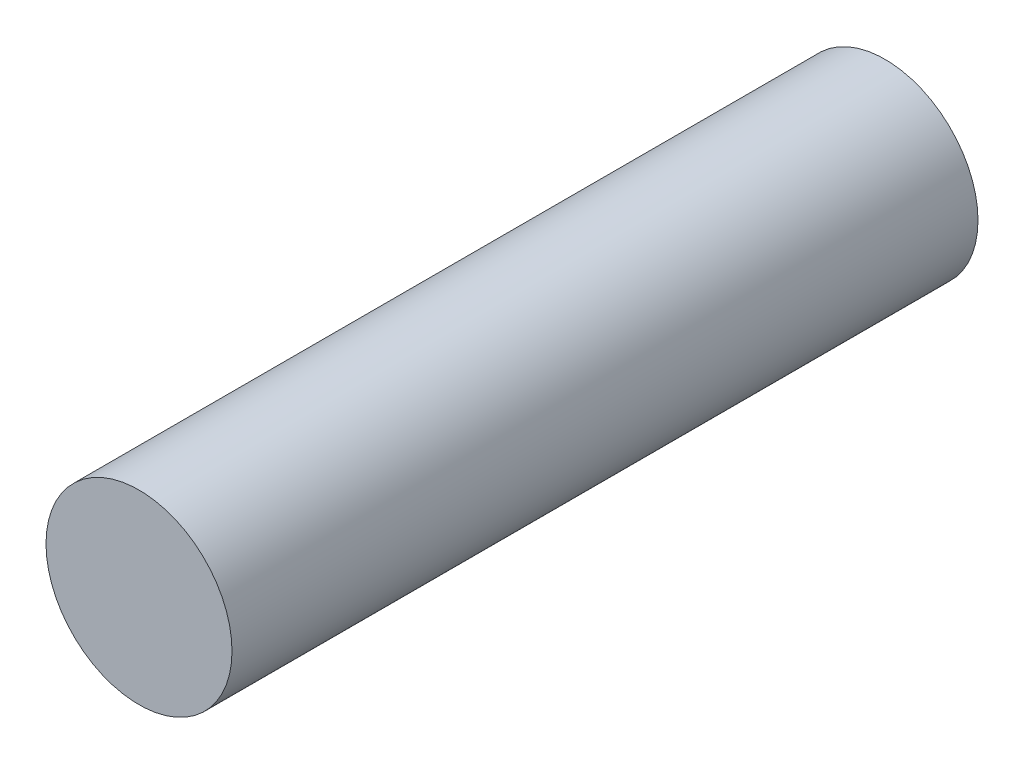
ISO-10303-21;
HEADER;
FILE_DESCRIPTION(('STEP AP214'),'2;1');
FILE_NAME('part.step','',(''),(''),'','','');
FILE_SCHEMA(('AUTOMOTIVE_DESIGN { 1 0 10303 214 1 1 1 1 }'));
ENDSEC;
DATA;
#1=APPLICATION_CONTEXT('core data for automotive mechanical design processes');
#2=APPLICATION_PROTOCOL_DEFINITION('international standard','automotive_design',2000,#1);
#3=PRODUCT_CONTEXT('',#1,'mechanical');
#4=PRODUCT('Part','Part','',(#3));
#5=PRODUCT_RELATED_PRODUCT_CATEGORY('part','',(#4));
#6=PRODUCT_DEFINITION_FORMATION('','',#4);
#7=PRODUCT_DEFINITION_CONTEXT('part definition',#1,'design');
#8=PRODUCT_DEFINITION('design','',#6,#7);
#9=PRODUCT_DEFINITION_SHAPE('','',#8);
#10=(LENGTH_UNIT() NAMED_UNIT(*) SI_UNIT(.MILLI.,.METRE.));
#11=(NAMED_UNIT(*) PLANE_ANGLE_UNIT() SI_UNIT($,.RADIAN.));
#12=(NAMED_UNIT(*) SI_UNIT($,.STERADIAN.) SOLID_ANGLE_UNIT());
#13=UNCERTAINTY_MEASURE_WITH_UNIT(LENGTH_MEASURE(1.E-05),#10,'distance_accuracy_value','');
#14=(GEOMETRIC_REPRESENTATION_CONTEXT(3) GLOBAL_UNCERTAINTY_ASSIGNED_CONTEXT((#13)) GLOBAL_UNIT_ASSIGNED_CONTEXT((#10,
#11,#12)) REPRESENTATION_CONTEXT('',''));
#15=CARTESIAN_POINT('',(0.,0.,0.));
#16=DIRECTION('',(0.,0.,1.));
#17=DIRECTION('',(1.,0.,0.));
#18=AXIS2_PLACEMENT_3D('',#15,#16,#17);
#19=CARTESIAN_POINT('',(-162.918245427395,-13.5765204522829,19.05));
#20=DIRECTION('',(0.,0.,-1.));
#21=DIRECTION('',(-1.,0.,0.));
#22=AXIS2_PLACEMENT_3D('',#19,#20,#21);
#23=CYLINDRICAL_SURFACE('',#22,2.37490000000002);
#24=CARTESIAN_POINT('',(-162.918245427395,-13.5765204522829,19.05));
#25=DIRECTION('',(0.,0.,1.));
#26=DIRECTION('',(1.,0.,0.));
#27=AXIS2_PLACEMENT_3D('',#24,#25,#26);
#28=CIRCLE('',#27,2.37490000000002);
#29=CARTESIAN_POINT('',(-165.293145427395,-13.5765204522829,19.05));
#30=VERTEX_POINT('',#29);
#31=EDGE_CURVE('E10',#30,#30,#28,.T.);
#32=CARTESIAN_POINT('',(-162.918245427395,-13.5765204522829,0.));
#33=DIRECTION('',(0.,0.,1.));
#34=DIRECTION('',(1.,0.,0.));
#35=AXIS2_PLACEMENT_3D('',#32,#33,#34);
#36=CIRCLE('',#35,2.37490000000002);
#37=CARTESIAN_POINT('',(-165.293145427395,-13.5765204522829,0.));
#38=VERTEX_POINT('',#37);
#39=EDGE_CURVE('E35',#38,#38,#36,.T.);
#40=CARTESIAN_POINT('',(-165.293145427395,-13.5765204522829,19.05));
#41=CARTESIAN_POINT('',(-165.293145427395,-13.5765204522829,18.8515625));
#42=CARTESIAN_POINT('',(-165.293145427395,-13.5765204522829,18.653125));
#43=CARTESIAN_POINT('',(-165.293145427395,-13.5765204522829,18.25625));
#44=CARTESIAN_POINT('',(-165.293145427395,-13.5765204522829,18.0578125));
#45=CARTESIAN_POINT('',(-165.293145427395,-13.5765204522829,17.6609375));
#46=CARTESIAN_POINT('',(-165.293145427395,-13.5765204522829,17.4625));
#47=CARTESIAN_POINT('',(-165.293145427395,-13.5765204522829,17.065625));
#48=CARTESIAN_POINT('',(-165.293145427395,-13.5765204522829,16.8671875));
#49=CARTESIAN_POINT('',(-165.293145427395,-13.5765204522829,16.4703125));
#50=CARTESIAN_POINT('',(-165.293145427395,-13.5765204522829,16.271875));
#51=CARTESIAN_POINT('',(-165.293145427395,-13.5765204522829,15.875));
#52=CARTESIAN_POINT('',(-165.293145427395,-13.5765204522829,15.6765625));
#53=CARTESIAN_POINT('',(-165.293145427395,-13.5765204522829,15.2796875));
#54=CARTESIAN_POINT('',(-165.293145427395,-13.5765204522829,15.08125));
#55=CARTESIAN_POINT('',(-165.293145427395,-13.5765204522829,14.684375));
#56=CARTESIAN_POINT('',(-165.293145427395,-13.5765204522829,14.4859375));
#57=CARTESIAN_POINT('',(-165.293145427395,-13.5765204522829,14.0890625));
#58=CARTESIAN_POINT('',(-165.293145427395,-13.5765204522829,13.890625));
#59=CARTESIAN_POINT('',(-165.293145427395,-13.5765204522829,13.49375));
#60=CARTESIAN_POINT('',(-165.293145427395,-13.5765204522829,13.2953125));
#61=CARTESIAN_POINT('',(-165.293145427395,-13.5765204522829,12.8984375));
#62=CARTESIAN_POINT('',(-165.293145427395,-13.5765204522829,12.7));
#63=CARTESIAN_POINT('',(-165.293145427395,-13.5765204522829,12.303125));
#64=CARTESIAN_POINT('',(-165.293145427395,-13.5765204522829,12.1046875));
#65=CARTESIAN_POINT('',(-165.293145427395,-13.5765204522829,11.7078125));
#66=CARTESIAN_POINT('',(-165.293145427395,-13.5765204522829,11.509375));
#67=CARTESIAN_POINT('',(-165.293145427395,-13.5765204522829,11.1125));
#68=CARTESIAN_POINT('',(-165.293145427395,-13.5765204522829,10.9140625));
#69=CARTESIAN_POINT('',(-165.293145427395,-13.5765204522829,10.5171875));
#70=CARTESIAN_POINT('',(-165.293145427395,-13.5765204522829,10.31875));
#71=CARTESIAN_POINT('',(-165.293145427395,-13.5765204522829,9.921875));
#72=CARTESIAN_POINT('',(-165.293145427395,-13.5765204522829,9.7234375));
#73=CARTESIAN_POINT('',(-165.293145427395,-13.5765204522829,9.3265625));
#74=CARTESIAN_POINT('',(-165.293145427395,-13.5765204522829,9.128125));
#75=CARTESIAN_POINT('',(-165.293145427395,-13.5765204522829,8.73125));
#76=CARTESIAN_POINT('',(-165.293145427395,-13.5765204522829,8.5328125));
#77=CARTESIAN_POINT('',(-165.293145427395,-13.5765204522829,8.1359375));
#78=CARTESIAN_POINT('',(-165.293145427395,-13.5765204522829,7.9375));
#79=CARTESIAN_POINT('',(-165.293145427395,-13.5765204522829,7.540625));
#80=CARTESIAN_POINT('',(-165.293145427395,-13.5765204522829,7.3421875));
#81=CARTESIAN_POINT('',(-165.293145427395,-13.5765204522829,6.9453125));
#82=CARTESIAN_POINT('',(-165.293145427395,-13.5765204522829,6.746875));
#83=CARTESIAN_POINT('',(-165.293145427395,-13.5765204522829,6.35));
#84=CARTESIAN_POINT('',(-165.293145427395,-13.5765204522829,6.1515625));
#85=CARTESIAN_POINT('',(-165.293145427395,-13.5765204522829,5.7546875));
#86=CARTESIAN_POINT('',(-165.293145427395,-13.5765204522829,5.55625));
#87=CARTESIAN_POINT('',(-165.293145427395,-13.5765204522829,5.159375));
#88=CARTESIAN_POINT('',(-165.293145427395,-13.5765204522829,4.9609375));
#89=CARTESIAN_POINT('',(-165.293145427395,-13.5765204522829,4.5640625));
#90=CARTESIAN_POINT('',(-165.293145427395,-13.5765204522829,4.365625));
#91=CARTESIAN_POINT('',(-165.293145427395,-13.5765204522829,3.96875));
#92=CARTESIAN_POINT('',(-165.293145427395,-13.5765204522829,3.7703125));
#93=CARTESIAN_POINT('',(-165.293145427395,-13.5765204522829,3.3734375));
#94=CARTESIAN_POINT('',(-165.293145427395,-13.5765204522829,3.175));
#95=CARTESIAN_POINT('',(-165.293145427395,-13.5765204522829,2.778125));
#96=CARTESIAN_POINT('',(-165.293145427395,-13.5765204522829,2.5796875));
#97=CARTESIAN_POINT('',(-165.293145427395,-13.5765204522829,2.1828125));
#98=CARTESIAN_POINT('',(-165.293145427395,-13.5765204522829,1.984375));
#99=CARTESIAN_POINT('',(-165.293145427395,-13.5765204522829,1.5875));
#100=CARTESIAN_POINT('',(-165.293145427395,-13.5765204522829,1.3890625));
#101=CARTESIAN_POINT('',(-165.293145427395,-13.5765204522829,0.992187500000001));
#102=CARTESIAN_POINT('',(-165.293145427395,-13.5765204522829,0.793750000000001));
#103=CARTESIAN_POINT('',(-165.293145427395,-13.5765204522829,0.396875));
#104=CARTESIAN_POINT('',(-165.293145427395,-13.5765204522829,0.1984375));
#105=CARTESIAN_POINT('',(-165.293145427395,-13.5765204522829,0.));
#106=B_SPLINE_CURVE_WITH_KNOTS('',3,(#40,#41,#42,#43,#44,#45,#46,#47,#48,#49,#50,#51,#52,#53,
#54,#55,#56,#57,#58,#59,#60,#61,#62,#63,#64,#65,#66,#67,#68,#69,#70,#71,#72,#73,#74,#75,#76,#77,
#78,#79,#80,#81,#82,#83,#84,#85,#86,#87,#88,#89,#90,#91,#92,#93,#94,#95,#96,#97,#98,#99,#100,
#101,#102,#103,#104,#105),.UNSPECIFIED.,.F.,.F.,(4,2,2,2,2,2,2,2,2,2,2,2,2,2,2,2,2,2,2,2,2,2,2,
2,2,2,2,2,2,2,2,2,4),(0.,0.5953125,1.190625,1.7859375,2.38125,2.9765625,3.571875,4.1671875,
4.7625,5.3578125,5.953125,6.5484375,7.14375,7.7390625,8.334375,8.9296875,9.525,10.1203125,
10.715625,11.3109375,11.90625,12.5015625,13.096875,13.6921875,14.2875,14.8828125,15.478125,
16.0734375,16.66875,17.2640625,17.859375,18.4546875,19.05),.UNSPECIFIED.);
#107=EDGE_CURVE('BSEAM32',#30,#38,#106,.T.);
#108=ORIENTED_EDGE('',*,*,#31,.F.);
#109=ORIENTED_EDGE('',*,*,#39,.T.);
#110=ORIENTED_EDGE('',*,*,#107,.T.);
#111=ORIENTED_EDGE('',*,*,#107,.F.);
#112=EDGE_LOOP('',(#108,#110,#109,#111));
#113=FACE_BOUND('',#112,.T.);
#114=ADVANCED_FACE('F32',(#113),#23,.T.);
#115=CARTESIAN_POINT('',(-162.918245427395,-13.5765204522829,19.05));
#116=DIRECTION('',(0.,0.,1.));
#117=DIRECTION('',(1.,0.,0.));
#118=AXIS2_PLACEMENT_3D('',#115,#116,#117);
#119=PLANE('',#118);
#120=ORIENTED_EDGE('',*,*,#31,.T.);
#121=EDGE_LOOP('',(#120));
#122=FACE_BOUND('',#121,.T.);
#123=ADVANCED_FACE('F47',(#122),#119,.T.);
#124=CARTESIAN_POINT('',(-162.918245427395,-13.5765204522829,0.));
#125=DIRECTION('',(0.,0.,1.));
#126=DIRECTION('',(1.,0.,0.));
#127=AXIS2_PLACEMENT_3D('',#124,#125,#126);
#128=PLANE('',#127);
#129=ORIENTED_EDGE('',*,*,#39,.F.);
#130=EDGE_LOOP('',(#129));
#131=FACE_BOUND('',#130,.T.);
#132=ADVANCED_FACE('F45',(#131),#128,.F.);
#133=CLOSED_SHELL('',(#114,#123,#132));
#134=MANIFOLD_SOLID_BREP('B2',#133);
#135=ADVANCED_BREP_SHAPE_REPRESENTATION('',(#18,#134),#14);
#136=SHAPE_DEFINITION_REPRESENTATION(#9,#135);
ENDSEC;
END-ISO-10303-21;
